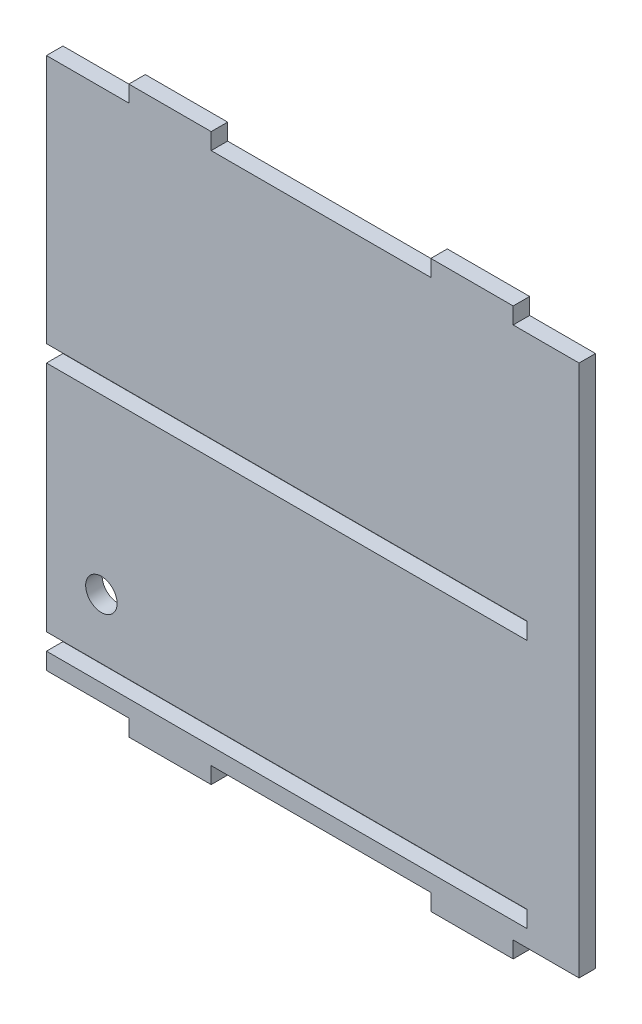
ISO-10303-21;
HEADER;
FILE_DESCRIPTION(('STEP AP214'),'2;1');
FILE_NAME('part.step','',(''),(''),'','','');
FILE_SCHEMA(('AUTOMOTIVE_DESIGN { 1 0 10303 214 1 1 1 1 }'));
ENDSEC;
DATA;
#1=APPLICATION_CONTEXT('core data for automotive mechanical design processes');
#2=APPLICATION_PROTOCOL_DEFINITION('international standard','automotive_design',2000,#1);
#3=PRODUCT_CONTEXT('',#1,'mechanical');
#4=PRODUCT('Part','Part','',(#3));
#5=PRODUCT_RELATED_PRODUCT_CATEGORY('part','',(#4));
#6=PRODUCT_DEFINITION_FORMATION('','',#4);
#7=PRODUCT_DEFINITION_CONTEXT('part definition',#1,'design');
#8=PRODUCT_DEFINITION('design','',#6,#7);
#9=PRODUCT_DEFINITION_SHAPE('','',#8);
#10=(LENGTH_UNIT() NAMED_UNIT(*) SI_UNIT(.MILLI.,.METRE.));
#11=(NAMED_UNIT(*) PLANE_ANGLE_UNIT() SI_UNIT($,.RADIAN.));
#12=(NAMED_UNIT(*) SI_UNIT($,.STERADIAN.) SOLID_ANGLE_UNIT());
#13=UNCERTAINTY_MEASURE_WITH_UNIT(LENGTH_MEASURE(1.E-05),#10,'distance_accuracy_value','');
#14=(GEOMETRIC_REPRESENTATION_CONTEXT(3) GLOBAL_UNCERTAINTY_ASSIGNED_CONTEXT((#13)) GLOBAL_UNIT_ASSIGNED_CONTEXT((#10,
#11,#12)) REPRESENTATION_CONTEXT('',''));
#15=CARTESIAN_POINT('',(0.,0.,0.));
#16=DIRECTION('',(0.,0.,1.));
#17=DIRECTION('',(1.,0.,0.));
#18=AXIS2_PLACEMENT_3D('',#15,#16,#17);
#19=CARTESIAN_POINT('',(-97.,97.,6.));
#20=DIRECTION('',(1.,0.,0.));
#21=DIRECTION('',(0.,1.,0.));
#22=AXIS2_PLACEMENT_3D('',#19,#20,#21);
#23=PLANE('',#22);
#24=DIRECTION('',(0.,-1.,0.));
#25=VECTOR('',#24,1.);
#26=CARTESIAN_POINT('',(-97.,97.,0.));
#27=LINE('',#26,#25);
#28=CARTESIAN_POINT('',(-97.,97.,0.));
#29=VERTEX_POINT('',#28);
#30=CARTESIAN_POINT('',(-97.,6.1,0.));
#31=VERTEX_POINT('',#30);
#32=EDGE_CURVE('E329',#29,#31,#27,.T.);
#33=ORIENTED_EDGE('',*,*,#32,.T.);
#34=DIRECTION('',(0.,0.,1.));
#35=VECTOR('',#34,1.);
#36=CARTESIAN_POINT('',(-97.,6.1,-4.));
#37=LINE('',#36,#35);
#38=CARTESIAN_POINT('',(-97.,6.1,6.));
#39=VERTEX_POINT('',#38);
#40=EDGE_CURVE('E298',#31,#39,#37,.T.);
#41=ORIENTED_EDGE('',*,*,#40,.T.);
#42=DIRECTION('',(0.,-1.,0.));
#43=VECTOR('',#42,1.);
#44=CARTESIAN_POINT('',(-97.,97.,6.));
#45=LINE('',#44,#43);
#46=CARTESIAN_POINT('',(-97.,97.,6.));
#47=VERTEX_POINT('',#46);
#48=EDGE_CURVE('E259',#47,#39,#45,.T.);
#49=ORIENTED_EDGE('',*,*,#48,.F.);
#50=DIRECTION('',(0.,0.,-1.));
#51=VECTOR('',#50,1.);
#52=CARTESIAN_POINT('',(-97.,97.,6.));
#53=LINE('',#52,#51);
#54=EDGE_CURVE('E394',#47,#29,#53,.T.);
#55=ORIENTED_EDGE('',*,*,#54,.T.);
#56=EDGE_LOOP('',(#33,#41,#49,#55));
#57=FACE_BOUND('',#56,.T.);
#58=ADVANCED_FACE('F45',(#57),#23,.F.);
#59=CARTESIAN_POINT('',(-97.,0.,6.));
#60=VERTEX_POINT('',#59);
#61=CARTESIAN_POINT('',(-97.,-84.8,6.));
#62=VERTEX_POINT('',#61);
#63=EDGE_CURVE('E248',#60,#62,#45,.T.);
#64=ORIENTED_EDGE('',*,*,#63,.F.);
#65=DIRECTION('',(0.,0.,1.));
#66=VECTOR('',#65,1.);
#67=CARTESIAN_POINT('',(-97.,0.,-4.));
#68=LINE('',#67,#66);
#69=CARTESIAN_POINT('',(-97.,0.,0.));
#70=VERTEX_POINT('',#69);
#71=EDGE_CURVE('E229',#70,#60,#68,.T.);
#72=ORIENTED_EDGE('',*,*,#71,.F.);
#73=CARTESIAN_POINT('',(-97.,-84.8,0.));
#74=VERTEX_POINT('',#73);
#75=EDGE_CURVE('E334',#70,#74,#27,.T.);
#76=ORIENTED_EDGE('',*,*,#75,.T.);
#77=DIRECTION('',(0.,0.,1.));
#78=VECTOR('',#77,1.);
#79=CARTESIAN_POINT('',(-97.,-84.8,-4.));
#80=LINE('',#79,#78);
#81=EDGE_CURVE('E257',#74,#62,#80,.T.);
#82=ORIENTED_EDGE('',*,*,#81,.T.);
#83=EDGE_LOOP('',(#64,#72,#76,#82));
#84=FACE_BOUND('',#83,.T.);
#85=ADVANCED_FACE('F256',(#84),#23,.F.);
#86=CARTESIAN_POINT('',(73.,-97.,6.));
#87=DIRECTION('',(0.,1.,0.));
#88=DIRECTION('',(-1.,0.,0.));
#89=AXIS2_PLACEMENT_3D('',#86,#87,#88);
#90=PLANE('',#89);
#91=DIRECTION('',(1.,0.,0.));
#92=VECTOR('',#91,1.);
#93=CARTESIAN_POINT('',(73.,-97.,0.));
#94=LINE('',#93,#92);
#95=CARTESIAN_POINT('',(73.,-97.,0.));
#96=VERTEX_POINT('',#95);
#97=CARTESIAN_POINT('',(97.,-97.,0.));
#98=VERTEX_POINT('',#97);
#99=EDGE_CURVE('E293',#96,#98,#94,.T.);
#100=ORIENTED_EDGE('',*,*,#99,.T.);
#101=DIRECTION('',(0.,0.,-1.));
#102=VECTOR('',#101,1.);
#103=CARTESIAN_POINT('',(97.,-97.,6.));
#104=LINE('',#103,#102);
#105=CARTESIAN_POINT('',(97.,-97.,6.));
#106=VERTEX_POINT('',#105);
#107=EDGE_CURVE('E434',#106,#98,#104,.T.);
#108=ORIENTED_EDGE('',*,*,#107,.F.);
#109=DIRECTION('',(1.,0.,0.));
#110=VECTOR('',#109,1.);
#111=CARTESIAN_POINT('',(73.,-97.,6.));
#112=LINE('',#111,#110);
#113=CARTESIAN_POINT('',(73.,-97.,6.));
#114=VERTEX_POINT('',#113);
#115=EDGE_CURVE('E358',#114,#106,#112,.T.);
#116=ORIENTED_EDGE('',*,*,#115,.F.);
#117=DIRECTION('',(0.,0.,-1.));
#118=VECTOR('',#117,1.);
#119=CARTESIAN_POINT('',(73.,-97.,6.));
#120=LINE('',#119,#118);
#121=EDGE_CURVE('E292',#114,#96,#120,.T.);
#122=ORIENTED_EDGE('',*,*,#121,.T.);
#123=EDGE_LOOP('',(#100,#108,#116,#122));
#124=FACE_BOUND('',#123,.T.);
#125=ADVANCED_FACE('F47',(#124),#90,.F.);
#126=CARTESIAN_POINT('',(97.,97.,6.));
#127=DIRECTION('',(-1.,0.,0.));
#128=DIRECTION('',(0.,-1.,0.));
#129=AXIS2_PLACEMENT_3D('',#126,#127,#128);
#130=PLANE('',#129);
#131=DIRECTION('',(0.,1.,0.));
#132=VECTOR('',#131,1.);
#133=CARTESIAN_POINT('',(97.,97.,0.));
#134=LINE('',#133,#132);
#135=CARTESIAN_POINT('',(97.,97.,0.));
#136=VERTEX_POINT('',#135);
#137=EDGE_CURVE('E297',#98,#136,#134,.T.);
#138=ORIENTED_EDGE('',*,*,#137,.T.);
#139=DIRECTION('',(0.,0.,-1.));
#140=VECTOR('',#139,1.);
#141=CARTESIAN_POINT('',(97.,97.,6.));
#142=LINE('',#141,#140);
#143=CARTESIAN_POINT('',(97.,97.,6.));
#144=VERTEX_POINT('',#143);
#145=EDGE_CURVE('E430',#144,#136,#142,.T.);
#146=ORIENTED_EDGE('',*,*,#145,.F.);
#147=DIRECTION('',(0.,1.,0.));
#148=VECTOR('',#147,1.);
#149=CARTESIAN_POINT('',(97.,97.,6.));
#150=LINE('',#149,#148);
#151=EDGE_CURVE('E502',#106,#144,#150,.T.);
#152=ORIENTED_EDGE('',*,*,#151,.F.);
#153=ORIENTED_EDGE('',*,*,#107,.T.);
#154=EDGE_LOOP('',(#138,#146,#152,#153));
#155=FACE_BOUND('',#154,.T.);
#156=ADVANCED_FACE('F621',(#155),#130,.F.);
#157=CARTESIAN_POINT('',(73.,97.,6.));
#158=DIRECTION('',(0.,-1.,0.));
#159=DIRECTION('',(0.,0.,-1.));
#160=AXIS2_PLACEMENT_3D('',#157,#158,#159);
#161=PLANE('',#160);
#162=DIRECTION('',(-1.,0.,0.));
#163=VECTOR('',#162,1.);
#164=CARTESIAN_POINT('',(73.,97.,0.));
#165=LINE('',#164,#163);
#166=CARTESIAN_POINT('',(73.,97.,0.));
#167=VERTEX_POINT('',#166);
#168=EDGE_CURVE('E301',#136,#167,#165,.T.);
#169=ORIENTED_EDGE('',*,*,#168,.T.);
#170=DIRECTION('',(0.,0.,-1.));
#171=VECTOR('',#170,1.);
#172=CARTESIAN_POINT('',(73.,97.,6.));
#173=LINE('',#172,#171);
#174=CARTESIAN_POINT('',(73.,97.,6.));
#175=VERTEX_POINT('',#174);
#176=EDGE_CURVE('E426',#175,#167,#173,.T.);
#177=ORIENTED_EDGE('',*,*,#176,.F.);
#178=DIRECTION('',(-1.,0.,0.));
#179=VECTOR('',#178,1.);
#180=CARTESIAN_POINT('',(73.,97.,6.));
#181=LINE('',#180,#179);
#182=EDGE_CURVE('E505',#144,#175,#181,.T.);
#183=ORIENTED_EDGE('',*,*,#182,.F.);
#184=ORIENTED_EDGE('',*,*,#145,.T.);
#185=EDGE_LOOP('',(#169,#177,#183,#184));
#186=FACE_BOUND('',#185,.T.);
#187=ADVANCED_FACE('F618',(#186),#161,.F.);
#188=CARTESIAN_POINT('',(73.,97.,6.));
#189=DIRECTION('',(-1.,0.,0.));
#190=DIRECTION('',(0.,0.,1.));
#191=AXIS2_PLACEMENT_3D('',#188,#189,#190);
#192=PLANE('',#191);
#193=DIRECTION('',(0.,1.,0.));
#194=VECTOR('',#193,1.);
#195=CARTESIAN_POINT('',(73.,97.,0.));
#196=LINE('',#195,#194);
#197=CARTESIAN_POINT('',(73.,103.,0.));
#198=VERTEX_POINT('',#197);
#199=EDGE_CURVE('E304',#167,#198,#196,.T.);
#200=ORIENTED_EDGE('',*,*,#199,.T.);
#201=DIRECTION('',(0.,0.,-1.));
#202=VECTOR('',#201,1.);
#203=CARTESIAN_POINT('',(73.,103.,6.));
#204=LINE('',#203,#202);
#205=CARTESIAN_POINT('',(73.,103.,6.));
#206=VERTEX_POINT('',#205);
#207=EDGE_CURVE('E422',#206,#198,#204,.T.);
#208=ORIENTED_EDGE('',*,*,#207,.F.);
#209=DIRECTION('',(0.,1.,0.));
#210=VECTOR('',#209,1.);
#211=CARTESIAN_POINT('',(73.,97.,6.));
#212=LINE('',#211,#210);
#213=EDGE_CURVE('E508',#175,#206,#212,.T.);
#214=ORIENTED_EDGE('',*,*,#213,.F.);
#215=ORIENTED_EDGE('',*,*,#176,.T.);
#216=EDGE_LOOP('',(#200,#208,#214,#215));
#217=FACE_BOUND('',#216,.T.);
#218=ADVANCED_FACE('F614',(#217),#192,.F.);
#219=CARTESIAN_POINT('',(43.,103.,6.));
#220=DIRECTION('',(0.,-1.,0.));
#221=DIRECTION('',(0.,0.,-1.));
#222=AXIS2_PLACEMENT_3D('',#219,#220,#221);
#223=PLANE('',#222);
#224=DIRECTION('',(-1.,0.,0.));
#225=VECTOR('',#224,1.);
#226=CARTESIAN_POINT('',(43.,103.,0.));
#227=LINE('',#226,#225);
#228=CARTESIAN_POINT('',(43.,103.,0.));
#229=VERTEX_POINT('',#228);
#230=EDGE_CURVE('E307',#198,#229,#227,.T.);
#231=ORIENTED_EDGE('',*,*,#230,.T.);
#232=DIRECTION('',(0.,0.,-1.));
#233=VECTOR('',#232,1.);
#234=CARTESIAN_POINT('',(43.,103.,6.));
#235=LINE('',#234,#233);
#236=CARTESIAN_POINT('',(43.,103.,6.));
#237=VERTEX_POINT('',#236);
#238=EDGE_CURVE('E418',#237,#229,#235,.T.);
#239=ORIENTED_EDGE('',*,*,#238,.F.);
#240=DIRECTION('',(-1.,0.,0.));
#241=VECTOR('',#240,1.);
#242=CARTESIAN_POINT('',(43.,103.,6.));
#243=LINE('',#242,#241);
#244=EDGE_CURVE('E511',#206,#237,#243,.T.);
#245=ORIENTED_EDGE('',*,*,#244,.F.);
#246=ORIENTED_EDGE('',*,*,#207,.T.);
#247=EDGE_LOOP('',(#231,#239,#245,#246));
#248=FACE_BOUND('',#247,.T.);
#249=ADVANCED_FACE('F610',(#248),#223,.F.);
#250=CARTESIAN_POINT('',(43.,97.,6.));
#251=DIRECTION('',(1.,0.,0.));
#252=DIRECTION('',(0.,0.,-1.));
#253=AXIS2_PLACEMENT_3D('',#250,#251,#252);
#254=PLANE('',#253);
#255=DIRECTION('',(0.,-1.,0.));
#256=VECTOR('',#255,1.);
#257=CARTESIAN_POINT('',(43.,97.,0.));
#258=LINE('',#257,#256);
#259=CARTESIAN_POINT('',(43.,97.,0.));
#260=VERTEX_POINT('',#259);
#261=EDGE_CURVE('E310',#229,#260,#258,.T.);
#262=ORIENTED_EDGE('',*,*,#261,.T.);
#263=DIRECTION('',(0.,0.,-1.));
#264=VECTOR('',#263,1.);
#265=CARTESIAN_POINT('',(43.,97.,6.));
#266=LINE('',#265,#264);
#267=CARTESIAN_POINT('',(43.,97.,6.));
#268=VERTEX_POINT('',#267);
#269=EDGE_CURVE('E414',#268,#260,#266,.T.);
#270=ORIENTED_EDGE('',*,*,#269,.F.);
#271=DIRECTION('',(0.,-1.,0.));
#272=VECTOR('',#271,1.);
#273=CARTESIAN_POINT('',(43.,97.,6.));
#274=LINE('',#273,#272);
#275=EDGE_CURVE('E514',#237,#268,#274,.T.);
#276=ORIENTED_EDGE('',*,*,#275,.F.);
#277=ORIENTED_EDGE('',*,*,#238,.T.);
#278=EDGE_LOOP('',(#262,#270,#276,#277));
#279=FACE_BOUND('',#278,.T.);
#280=ADVANCED_FACE('F606',(#279),#254,.F.);
#281=CARTESIAN_POINT('',(-37.,97.,6.));
#282=DIRECTION('',(0.,-1.,0.));
#283=DIRECTION('',(0.,0.,-1.));
#284=AXIS2_PLACEMENT_3D('',#281,#282,#283);
#285=PLANE('',#284);
#286=DIRECTION('',(-1.,0.,0.));
#287=VECTOR('',#286,1.);
#288=CARTESIAN_POINT('',(-37.,97.,0.));
#289=LINE('',#288,#287);
#290=CARTESIAN_POINT('',(-37.,97.,0.));
#291=VERTEX_POINT('',#290);
#292=EDGE_CURVE('E313',#260,#291,#289,.T.);
#293=ORIENTED_EDGE('',*,*,#292,.T.);
#294=DIRECTION('',(0.,0.,-1.));
#295=VECTOR('',#294,1.);
#296=CARTESIAN_POINT('',(-37.,97.,6.));
#297=LINE('',#296,#295);
#298=CARTESIAN_POINT('',(-37.,97.,6.));
#299=VERTEX_POINT('',#298);
#300=EDGE_CURVE('E410',#299,#291,#297,.T.);
#301=ORIENTED_EDGE('',*,*,#300,.F.);
#302=DIRECTION('',(-1.,0.,0.));
#303=VECTOR('',#302,1.);
#304=CARTESIAN_POINT('',(-37.,97.,6.));
#305=LINE('',#304,#303);
#306=EDGE_CURVE('E517',#268,#299,#305,.T.);
#307=ORIENTED_EDGE('',*,*,#306,.F.);
#308=ORIENTED_EDGE('',*,*,#269,.T.);
#309=EDGE_LOOP('',(#293,#301,#307,#308));
#310=FACE_BOUND('',#309,.T.);
#311=ADVANCED_FACE('F602',(#310),#285,.F.);
#312=CARTESIAN_POINT('',(-37.,97.,6.));
#313=DIRECTION('',(-1.,0.,0.));
#314=DIRECTION('',(0.,0.,1.));
#315=AXIS2_PLACEMENT_3D('',#312,#313,#314);
#316=PLANE('',#315);
#317=DIRECTION('',(0.,1.,0.));
#318=VECTOR('',#317,1.);
#319=CARTESIAN_POINT('',(-37.,97.,0.));
#320=LINE('',#319,#318);
#321=CARTESIAN_POINT('',(-37.,103.,0.));
#322=VERTEX_POINT('',#321);
#323=EDGE_CURVE('E316',#291,#322,#320,.T.);
#324=ORIENTED_EDGE('',*,*,#323,.T.);
#325=DIRECTION('',(0.,0.,-1.));
#326=VECTOR('',#325,1.);
#327=CARTESIAN_POINT('',(-37.,103.,6.));
#328=LINE('',#327,#326);
#329=CARTESIAN_POINT('',(-37.,103.,6.));
#330=VERTEX_POINT('',#329);
#331=EDGE_CURVE('E406',#330,#322,#328,.T.);
#332=ORIENTED_EDGE('',*,*,#331,.F.);
#333=DIRECTION('',(0.,1.,0.));
#334=VECTOR('',#333,1.);
#335=CARTESIAN_POINT('',(-37.,97.,6.));
#336=LINE('',#335,#334);
#337=EDGE_CURVE('E520',#299,#330,#336,.T.);
#338=ORIENTED_EDGE('',*,*,#337,.F.);
#339=ORIENTED_EDGE('',*,*,#300,.T.);
#340=EDGE_LOOP('',(#324,#332,#338,#339));
#341=FACE_BOUND('',#340,.T.);
#342=ADVANCED_FACE('F598',(#341),#316,.F.);
#343=CARTESIAN_POINT('',(-67.,103.,6.));
#344=DIRECTION('',(0.,-1.,0.));
#345=DIRECTION('',(0.,0.,-1.));
#346=AXIS2_PLACEMENT_3D('',#343,#344,#345);
#347=PLANE('',#346);
#348=DIRECTION('',(-1.,0.,0.));
#349=VECTOR('',#348,1.);
#350=CARTESIAN_POINT('',(-67.,103.,0.));
#351=LINE('',#350,#349);
#352=CARTESIAN_POINT('',(-67.,103.,0.));
#353=VERTEX_POINT('',#352);
#354=EDGE_CURVE('E319',#322,#353,#351,.T.);
#355=ORIENTED_EDGE('',*,*,#354,.T.);
#356=DIRECTION('',(0.,0.,-1.));
#357=VECTOR('',#356,1.);
#358=CARTESIAN_POINT('',(-67.,103.,6.));
#359=LINE('',#358,#357);
#360=CARTESIAN_POINT('',(-67.,103.,6.));
#361=VERTEX_POINT('',#360);
#362=EDGE_CURVE('E402',#361,#353,#359,.T.);
#363=ORIENTED_EDGE('',*,*,#362,.F.);
#364=DIRECTION('',(-1.,0.,0.));
#365=VECTOR('',#364,1.);
#366=CARTESIAN_POINT('',(-67.,103.,6.));
#367=LINE('',#366,#365);
#368=EDGE_CURVE('E523',#330,#361,#367,.T.);
#369=ORIENTED_EDGE('',*,*,#368,.F.);
#370=ORIENTED_EDGE('',*,*,#331,.T.);
#371=EDGE_LOOP('',(#355,#363,#369,#370));
#372=FACE_BOUND('',#371,.T.);
#373=ADVANCED_FACE('F592',(#372),#347,.F.);
#374=CARTESIAN_POINT('',(-67.,97.,6.));
#375=DIRECTION('',(1.,0.,0.));
#376=DIRECTION('',(0.,0.,-1.));
#377=AXIS2_PLACEMENT_3D('',#374,#375,#376);
#378=PLANE('',#377);
#379=DIRECTION('',(0.,-1.,0.));
#380=VECTOR('',#379,1.);
#381=CARTESIAN_POINT('',(-67.,97.,0.));
#382=LINE('',#381,#380);
#383=CARTESIAN_POINT('',(-67.,97.,0.));
#384=VERTEX_POINT('',#383);
#385=EDGE_CURVE('E322',#353,#384,#382,.T.);
#386=ORIENTED_EDGE('',*,*,#385,.T.);
#387=DIRECTION('',(0.,0.,-1.));
#388=VECTOR('',#387,1.);
#389=CARTESIAN_POINT('',(-67.,97.,6.));
#390=LINE('',#389,#388);
#391=CARTESIAN_POINT('',(-67.,97.,6.));
#392=VERTEX_POINT('',#391);
#393=EDGE_CURVE('E398',#392,#384,#390,.T.);
#394=ORIENTED_EDGE('',*,*,#393,.F.);
#395=DIRECTION('',(0.,-1.,0.));
#396=VECTOR('',#395,1.);
#397=CARTESIAN_POINT('',(-67.,97.,6.));
#398=LINE('',#397,#396);
#399=EDGE_CURVE('E525',#361,#392,#398,.T.);
#400=ORIENTED_EDGE('',*,*,#399,.F.);
#401=ORIENTED_EDGE('',*,*,#362,.T.);
#402=EDGE_LOOP('',(#386,#394,#400,#401));
#403=FACE_BOUND('',#402,.T.);
#404=ADVANCED_FACE('F588',(#403),#378,.F.);
#405=CARTESIAN_POINT('',(-67.,97.,6.));
#406=DIRECTION('',(0.,-1.,0.));
#407=DIRECTION('',(0.,0.,-1.));
#408=AXIS2_PLACEMENT_3D('',#405,#406,#407);
#409=PLANE('',#408);
#410=DIRECTION('',(-1.,0.,0.));
#411=VECTOR('',#410,1.);
#412=CARTESIAN_POINT('',(-67.,97.,0.));
#413=LINE('',#412,#411);
#414=EDGE_CURVE('E325',#384,#29,#413,.T.);
#415=ORIENTED_EDGE('',*,*,#414,.T.);
#416=ORIENTED_EDGE('',*,*,#54,.F.);
#417=DIRECTION('',(-1.,0.,0.));
#418=VECTOR('',#417,1.);
#419=CARTESIAN_POINT('',(-67.,97.,6.));
#420=LINE('',#419,#418);
#421=EDGE_CURVE('E265',#392,#47,#420,.T.);
#422=ORIENTED_EDGE('',*,*,#421,.F.);
#423=ORIENTED_EDGE('',*,*,#393,.T.);
#424=EDGE_LOOP('',(#415,#416,#422,#423));
#425=FACE_BOUND('',#424,.T.);
#426=ADVANCED_FACE('F534',(#425),#409,.F.);
#427=CARTESIAN_POINT('',(-97.,-90.9,6.));
#428=VERTEX_POINT('',#427);
#429=CARTESIAN_POINT('',(-97.,-97.,6.));
#430=VERTEX_POINT('',#429);
#431=EDGE_CURVE('E260',#428,#430,#45,.T.);
#432=ORIENTED_EDGE('',*,*,#431,.F.);
#433=DIRECTION('',(0.,0.,1.));
#434=VECTOR('',#433,1.);
#435=CARTESIAN_POINT('',(-97.,-90.9,-4.));
#436=LINE('',#435,#434);
#437=CARTESIAN_POINT('',(-97.,-90.9,0.));
#438=VERTEX_POINT('',#437);
#439=EDGE_CURVE('E469',#438,#428,#436,.T.);
#440=ORIENTED_EDGE('',*,*,#439,.F.);
#441=CARTESIAN_POINT('',(-97.,-97.,0.));
#442=VERTEX_POINT('',#441);
#443=EDGE_CURVE('E328',#438,#442,#27,.T.);
#444=ORIENTED_EDGE('',*,*,#443,.T.);
#445=DIRECTION('',(0.,0.,-1.));
#446=VECTOR('',#445,1.);
#447=CARTESIAN_POINT('',(-97.,-97.,6.));
#448=LINE('',#447,#446);
#449=EDGE_CURVE('E390',#430,#442,#448,.T.);
#450=ORIENTED_EDGE('',*,*,#449,.F.);
#451=EDGE_LOOP('',(#432,#440,#444,#450));
#452=FACE_BOUND('',#451,.T.);
#453=ADVANCED_FACE('F467',(#452),#23,.F.);
#454=CARTESIAN_POINT('',(-67.,-97.,6.));
#455=DIRECTION('',(0.,1.,0.));
#456=DIRECTION('',(0.,0.,1.));
#457=AXIS2_PLACEMENT_3D('',#454,#455,#456);
#458=PLANE('',#457);
#459=DIRECTION('',(1.,0.,0.));
#460=VECTOR('',#459,1.);
#461=CARTESIAN_POINT('',(-67.,-97.,0.));
#462=LINE('',#461,#460);
#463=CARTESIAN_POINT('',(-67.,-97.,0.));
#464=VERTEX_POINT('',#463);
#465=EDGE_CURVE('E333',#442,#464,#462,.T.);
#466=ORIENTED_EDGE('',*,*,#465,.T.);
#467=DIRECTION('',(0.,0.,-1.));
#468=VECTOR('',#467,1.);
#469=CARTESIAN_POINT('',(-67.,-97.,6.));
#470=LINE('',#469,#468);
#471=CARTESIAN_POINT('',(-67.,-97.,6.));
#472=VERTEX_POINT('',#471);
#473=EDGE_CURVE('E386',#472,#464,#470,.T.);
#474=ORIENTED_EDGE('',*,*,#473,.F.);
#475=DIRECTION('',(1.,0.,0.));
#476=VECTOR('',#475,1.);
#477=CARTESIAN_POINT('',(-67.,-97.,6.));
#478=LINE('',#477,#476);
#479=EDGE_CURVE('E264',#430,#472,#478,.T.);
#480=ORIENTED_EDGE('',*,*,#479,.F.);
#481=ORIENTED_EDGE('',*,*,#449,.T.);
#482=EDGE_LOOP('',(#466,#474,#480,#481));
#483=FACE_BOUND('',#482,.T.);
#484=ADVANCED_FACE('F473',(#483),#458,.F.);
#485=CARTESIAN_POINT('',(-67.,-97.,6.));
#486=DIRECTION('',(1.,0.,0.));
#487=DIRECTION('',(0.,0.,-1.));
#488=AXIS2_PLACEMENT_3D('',#485,#486,#487);
#489=PLANE('',#488);
#490=DIRECTION('',(0.,-1.,0.));
#491=VECTOR('',#490,1.);
#492=CARTESIAN_POINT('',(-67.,-97.,0.));
#493=LINE('',#492,#491);
#494=CARTESIAN_POINT('',(-67.,-103.,0.));
#495=VERTEX_POINT('',#494);
#496=EDGE_CURVE('E337',#464,#495,#493,.T.);
#497=ORIENTED_EDGE('',*,*,#496,.T.);
#498=DIRECTION('',(0.,0.,-1.));
#499=VECTOR('',#498,1.);
#500=CARTESIAN_POINT('',(-67.,-103.,6.));
#501=LINE('',#500,#499);
#502=CARTESIAN_POINT('',(-67.,-103.,6.));
#503=VERTEX_POINT('',#502);
#504=EDGE_CURVE('E382',#503,#495,#501,.T.);
#505=ORIENTED_EDGE('',*,*,#504,.F.);
#506=DIRECTION('',(0.,-1.,0.));
#507=VECTOR('',#506,1.);
#508=CARTESIAN_POINT('',(-67.,-97.,6.));
#509=LINE('',#508,#507);
#510=EDGE_CURVE('E271',#472,#503,#509,.T.);
#511=ORIENTED_EDGE('',*,*,#510,.F.);
#512=ORIENTED_EDGE('',*,*,#473,.T.);
#513=EDGE_LOOP('',(#497,#505,#511,#512));
#514=FACE_BOUND('',#513,.T.);
#515=ADVANCED_FACE('F480',(#514),#489,.F.);
#516=CARTESIAN_POINT('',(-67.,-103.,6.));
#517=DIRECTION('',(0.,1.,0.));
#518=DIRECTION('',(-1.,0.,0.));
#519=AXIS2_PLACEMENT_3D('',#516,#517,#518);
#520=PLANE('',#519);
#521=DIRECTION('',(1.,0.,0.));
#522=VECTOR('',#521,1.);
#523=CARTESIAN_POINT('',(-67.,-103.,0.));
#524=LINE('',#523,#522);
#525=CARTESIAN_POINT('',(-37.,-103.,0.));
#526=VERTEX_POINT('',#525);
#527=EDGE_CURVE('E340',#495,#526,#524,.T.);
#528=ORIENTED_EDGE('',*,*,#527,.T.);
#529=DIRECTION('',(0.,0.,-1.));
#530=VECTOR('',#529,1.);
#531=CARTESIAN_POINT('',(-37.,-103.,6.));
#532=LINE('',#531,#530);
#533=CARTESIAN_POINT('',(-37.,-103.,6.));
#534=VERTEX_POINT('',#533);
#535=EDGE_CURVE('E378',#534,#526,#532,.T.);
#536=ORIENTED_EDGE('',*,*,#535,.F.);
#537=DIRECTION('',(1.,0.,0.));
#538=VECTOR('',#537,1.);
#539=CARTESIAN_POINT('',(-67.,-103.,6.));
#540=LINE('',#539,#538);
#541=EDGE_CURVE('E274',#503,#534,#540,.T.);
#542=ORIENTED_EDGE('',*,*,#541,.F.);
#543=ORIENTED_EDGE('',*,*,#504,.T.);
#544=EDGE_LOOP('',(#528,#536,#542,#543));
#545=FACE_BOUND('',#544,.T.);
#546=ADVANCED_FACE('F484',(#545),#520,.F.);
#547=CARTESIAN_POINT('',(-37.,-97.,6.));
#548=DIRECTION('',(-1.,0.,0.));
#549=DIRECTION('',(0.,-1.,0.));
#550=AXIS2_PLACEMENT_3D('',#547,#548,#549);
#551=PLANE('',#550);
#552=DIRECTION('',(0.,1.,0.));
#553=VECTOR('',#552,1.);
#554=CARTESIAN_POINT('',(-37.,-97.,0.));
#555=LINE('',#554,#553);
#556=CARTESIAN_POINT('',(-37.,-97.,0.));
#557=VERTEX_POINT('',#556);
#558=EDGE_CURVE('E343',#526,#557,#555,.T.);
#559=ORIENTED_EDGE('',*,*,#558,.T.);
#560=DIRECTION('',(0.,0.,-1.));
#561=VECTOR('',#560,1.);
#562=CARTESIAN_POINT('',(-37.,-97.,6.));
#563=LINE('',#562,#561);
#564=CARTESIAN_POINT('',(-37.,-97.,6.));
#565=VERTEX_POINT('',#564);
#566=EDGE_CURVE('E374',#565,#557,#563,.T.);
#567=ORIENTED_EDGE('',*,*,#566,.F.);
#568=DIRECTION('',(0.,1.,0.));
#569=VECTOR('',#568,1.);
#570=CARTESIAN_POINT('',(-37.,-97.,6.));
#571=LINE('',#570,#569);
#572=EDGE_CURVE('E277',#534,#565,#571,.T.);
#573=ORIENTED_EDGE('',*,*,#572,.F.);
#574=ORIENTED_EDGE('',*,*,#535,.T.);
#575=EDGE_LOOP('',(#559,#567,#573,#574));
#576=FACE_BOUND('',#575,.T.);
#577=ADVANCED_FACE('F666',(#576),#551,.F.);
#578=CARTESIAN_POINT('',(-37.,-97.,6.));
#579=DIRECTION('',(0.,1.,0.));
#580=DIRECTION('',(-1.,0.,0.));
#581=AXIS2_PLACEMENT_3D('',#578,#579,#580);
#582=PLANE('',#581);
#583=DIRECTION('',(1.,0.,0.));
#584=VECTOR('',#583,1.);
#585=CARTESIAN_POINT('',(-37.,-97.,0.));
#586=LINE('',#585,#584);
#587=CARTESIAN_POINT('',(43.,-97.,0.));
#588=VERTEX_POINT('',#587);
#589=EDGE_CURVE('E346',#557,#588,#586,.T.);
#590=ORIENTED_EDGE('',*,*,#589,.T.);
#591=DIRECTION('',(0.,0.,-1.));
#592=VECTOR('',#591,1.);
#593=CARTESIAN_POINT('',(43.,-97.,6.));
#594=LINE('',#593,#592);
#595=CARTESIAN_POINT('',(43.,-97.,6.));
#596=VERTEX_POINT('',#595);
#597=EDGE_CURVE('E370',#596,#588,#594,.T.);
#598=ORIENTED_EDGE('',*,*,#597,.F.);
#599=DIRECTION('',(1.,0.,0.));
#600=VECTOR('',#599,1.);
#601=CARTESIAN_POINT('',(-37.,-97.,6.));
#602=LINE('',#601,#600);
#603=EDGE_CURVE('E280',#565,#596,#602,.T.);
#604=ORIENTED_EDGE('',*,*,#603,.F.);
#605=ORIENTED_EDGE('',*,*,#566,.T.);
#606=EDGE_LOOP('',(#590,#598,#604,#605));
#607=FACE_BOUND('',#606,.T.);
#608=ADVANCED_FACE('F663',(#607),#582,.F.);
#609=CARTESIAN_POINT('',(43.,-97.,6.));
#610=DIRECTION('',(1.,0.,0.));
#611=DIRECTION('',(0.,0.,-1.));
#612=AXIS2_PLACEMENT_3D('',#609,#610,#611);
#613=PLANE('',#612);
#614=DIRECTION('',(0.,-1.,0.));
#615=VECTOR('',#614,1.);
#616=CARTESIAN_POINT('',(43.,-97.,0.));
#617=LINE('',#616,#615);
#618=CARTESIAN_POINT('',(43.,-103.,0.));
#619=VERTEX_POINT('',#618);
#620=EDGE_CURVE('E349',#588,#619,#617,.T.);
#621=ORIENTED_EDGE('',*,*,#620,.T.);
#622=DIRECTION('',(0.,0.,-1.));
#623=VECTOR('',#622,1.);
#624=CARTESIAN_POINT('',(43.,-103.,6.));
#625=LINE('',#624,#623);
#626=CARTESIAN_POINT('',(43.,-103.,6.));
#627=VERTEX_POINT('',#626);
#628=EDGE_CURVE('E366',#627,#619,#625,.T.);
#629=ORIENTED_EDGE('',*,*,#628,.F.);
#630=DIRECTION('',(0.,-1.,0.));
#631=VECTOR('',#630,1.);
#632=CARTESIAN_POINT('',(43.,-97.,6.));
#633=LINE('',#632,#631);
#634=EDGE_CURVE('E283',#596,#627,#633,.T.);
#635=ORIENTED_EDGE('',*,*,#634,.F.);
#636=ORIENTED_EDGE('',*,*,#597,.T.);
#637=EDGE_LOOP('',(#621,#629,#635,#636));
#638=FACE_BOUND('',#637,.T.);
#639=ADVANCED_FACE('F659',(#638),#613,.F.);
#640=CARTESIAN_POINT('',(43.,-103.,6.));
#641=DIRECTION('',(0.,1.,0.));
#642=DIRECTION('',(0.,0.,1.));
#643=AXIS2_PLACEMENT_3D('',#640,#641,#642);
#644=PLANE('',#643);
#645=DIRECTION('',(1.,0.,0.));
#646=VECTOR('',#645,1.);
#647=CARTESIAN_POINT('',(43.,-103.,0.));
#648=LINE('',#647,#646);
#649=CARTESIAN_POINT('',(73.,-103.,0.));
#650=VERTEX_POINT('',#649);
#651=EDGE_CURVE('E352',#619,#650,#648,.T.);
#652=ORIENTED_EDGE('',*,*,#651,.T.);
#653=DIRECTION('',(0.,0.,-1.));
#654=VECTOR('',#653,1.);
#655=CARTESIAN_POINT('',(73.,-103.,6.));
#656=LINE('',#655,#654);
#657=CARTESIAN_POINT('',(73.,-103.,6.));
#658=VERTEX_POINT('',#657);
#659=EDGE_CURVE('E362',#658,#650,#656,.T.);
#660=ORIENTED_EDGE('',*,*,#659,.F.);
#661=DIRECTION('',(1.,0.,0.));
#662=VECTOR('',#661,1.);
#663=CARTESIAN_POINT('',(43.,-103.,6.));
#664=LINE('',#663,#662);
#665=EDGE_CURVE('E286',#627,#658,#664,.T.);
#666=ORIENTED_EDGE('',*,*,#665,.F.);
#667=ORIENTED_EDGE('',*,*,#628,.T.);
#668=EDGE_LOOP('',(#652,#660,#666,#667));
#669=FACE_BOUND('',#668,.T.);
#670=ADVANCED_FACE('F655',(#669),#644,.F.);
#671=CARTESIAN_POINT('',(73.,-97.,6.));
#672=DIRECTION('',(-1.,0.,0.));
#673=DIRECTION('',(0.,-1.,0.));
#674=AXIS2_PLACEMENT_3D('',#671,#672,#673);
#675=PLANE('',#674);
#676=DIRECTION('',(0.,1.,0.));
#677=VECTOR('',#676,1.);
#678=CARTESIAN_POINT('',(73.,-97.,0.));
#679=LINE('',#678,#677);
#680=EDGE_CURVE('E355',#650,#96,#679,.T.);
#681=ORIENTED_EDGE('',*,*,#680,.T.);
#682=ORIENTED_EDGE('',*,*,#121,.F.);
#683=DIRECTION('',(0.,1.,0.));
#684=VECTOR('',#683,1.);
#685=CARTESIAN_POINT('',(73.,-97.,6.));
#686=LINE('',#685,#684);
#687=EDGE_CURVE('E289',#658,#114,#686,.T.);
#688=ORIENTED_EDGE('',*,*,#687,.F.);
#689=ORIENTED_EDGE('',*,*,#659,.T.);
#690=EDGE_LOOP('',(#681,#682,#688,#689));
#691=FACE_BOUND('',#690,.T.);
#692=ADVANCED_FACE('F651',(#691),#675,.F.);
#693=CARTESIAN_POINT('',(0.,0.,6.));
#694=DIRECTION('',(0.,0.,-1.));
#695=DIRECTION('',(-1.,0.,0.));
#696=AXIS2_PLACEMENT_3D('',#693,#694,#695);
#697=PLANE('',#696);
#698=CARTESIAN_POINT('',(-77.,-63.,6.));
#699=DIRECTION('',(0.,0.,1.));
#700=DIRECTION('',(1.,0.,0.));
#701=AXIS2_PLACEMENT_3D('',#698,#699,#700);
#702=CIRCLE('',#701,5.72499999999999);
#703=CARTESIAN_POINT('',(-71.275,-63.,6.));
#704=VERTEX_POINT('',#703);
#705=EDGE_CURVE('E803',#704,#704,#702,.T.);
#706=ORIENTED_EDGE('',*,*,#705,.F.);
#707=EDGE_LOOP('',(#706));
#708=FACE_BOUND('',#707,.T.);
#709=ORIENTED_EDGE('',*,*,#48,.T.);
#710=DIRECTION('',(-1.,0.,0.));
#711=VECTOR('',#710,1.);
#712=CARTESIAN_POINT('',(-97.,6.1,6.));
#713=LINE('',#712,#711);
#714=CARTESIAN_POINT('',(78.,6.1,6.));
#715=VERTEX_POINT('',#714);
#716=EDGE_CURVE('E241',#715,#39,#713,.T.);
#717=ORIENTED_EDGE('',*,*,#716,.F.);
#718=DIRECTION('',(0.,1.,0.));
#719=VECTOR('',#718,1.);
#720=CARTESIAN_POINT('',(78.,0.,6.));
#721=LINE('',#720,#719);
#722=CARTESIAN_POINT('',(78.,0.,6.));
#723=VERTEX_POINT('',#722);
#724=EDGE_CURVE('E251',#723,#715,#721,.T.);
#725=ORIENTED_EDGE('',*,*,#724,.F.);
#726=DIRECTION('',(1.,0.,0.));
#727=VECTOR('',#726,1.);
#728=CARTESIAN_POINT('',(-97.,0.,6.));
#729=LINE('',#728,#727);
#730=EDGE_CURVE('E232',#60,#723,#729,.T.);
#731=ORIENTED_EDGE('',*,*,#730,.F.);
#732=ORIENTED_EDGE('',*,*,#63,.T.);
#733=DIRECTION('',(-1.,0.,0.));
#734=VECTOR('',#733,1.);
#735=CARTESIAN_POINT('',(-97.,-84.8,6.));
#736=LINE('',#735,#734);
#737=CARTESIAN_POINT('',(78.,-84.8,6.));
#738=VERTEX_POINT('',#737);
#739=EDGE_CURVE('E495',#738,#62,#736,.T.);
#740=ORIENTED_EDGE('',*,*,#739,.F.);
#741=DIRECTION('',(0.,1.,0.));
#742=VECTOR('',#741,1.);
#743=CARTESIAN_POINT('',(78.,-90.9,6.));
#744=LINE('',#743,#742);
#745=CARTESIAN_POINT('',(78.,-90.9,6.));
#746=VERTEX_POINT('',#745);
#747=EDGE_CURVE('E491',#746,#738,#744,.T.);
#748=ORIENTED_EDGE('',*,*,#747,.F.);
#749=DIRECTION('',(1.,0.,0.));
#750=VECTOR('',#749,1.);
#751=CARTESIAN_POINT('',(-97.,-90.9,6.));
#752=LINE('',#751,#750);
#753=EDGE_CURVE('E253',#428,#746,#752,.T.);
#754=ORIENTED_EDGE('',*,*,#753,.F.);
#755=ORIENTED_EDGE('',*,*,#431,.T.);
#756=ORIENTED_EDGE('',*,*,#479,.T.);
#757=ORIENTED_EDGE('',*,*,#510,.T.);
#758=ORIENTED_EDGE('',*,*,#541,.T.);
#759=ORIENTED_EDGE('',*,*,#572,.T.);
#760=ORIENTED_EDGE('',*,*,#603,.T.);
#761=ORIENTED_EDGE('',*,*,#634,.T.);
#762=ORIENTED_EDGE('',*,*,#665,.T.);
#763=ORIENTED_EDGE('',*,*,#687,.T.);
#764=ORIENTED_EDGE('',*,*,#115,.T.);
#765=ORIENTED_EDGE('',*,*,#151,.T.);
#766=ORIENTED_EDGE('',*,*,#182,.T.);
#767=ORIENTED_EDGE('',*,*,#213,.T.);
#768=ORIENTED_EDGE('',*,*,#244,.T.);
#769=ORIENTED_EDGE('',*,*,#275,.T.);
#770=ORIENTED_EDGE('',*,*,#306,.T.);
#771=ORIENTED_EDGE('',*,*,#337,.T.);
#772=ORIENTED_EDGE('',*,*,#368,.T.);
#773=ORIENTED_EDGE('',*,*,#399,.T.);
#774=ORIENTED_EDGE('',*,*,#421,.T.);
#775=EDGE_LOOP('',(#709,#717,#725,#731,#732,#740,#748,#754,#755,#756,#757,#758,#759,#760,#761,
#762,#763,#764,#765,#766,#767,#768,#769,#770,#771,#772,#773,#774));
#776=FACE_BOUND('',#775,.T.);
#777=ADVANCED_FACE('F246',(#708,#776),#697,.F.);
#778=CARTESIAN_POINT('',(0.,0.,0.));
#779=DIRECTION('',(0.,0.,-1.));
#780=DIRECTION('',(-1.,0.,0.));
#781=AXIS2_PLACEMENT_3D('',#778,#779,#780);
#782=PLANE('',#781);
#783=CARTESIAN_POINT('',(-77.,-63.,0.));
#784=DIRECTION('',(0.,0.,-1.));
#785=DIRECTION('',(-1.,0.,0.));
#786=AXIS2_PLACEMENT_3D('',#783,#784,#785);
#787=CIRCLE('',#786,5.72499999999999);
#788=CARTESIAN_POINT('',(-82.725,-63.,0.));
#789=VERTEX_POINT('',#788);
#790=EDGE_CURVE('E49',#789,#789,#787,.T.);
#791=ORIENTED_EDGE('',*,*,#790,.F.);
#792=EDGE_LOOP('',(#791));
#793=FACE_BOUND('',#792,.T.);
#794=DIRECTION('',(1.,0.,0.));
#795=VECTOR('',#794,1.);
#796=CARTESIAN_POINT('',(0.,6.1,0.));
#797=LINE('',#796,#795);
#798=CARTESIAN_POINT('',(78.,6.1,0.));
#799=VERTEX_POINT('',#798);
#800=EDGE_CURVE('E11',#31,#799,#797,.T.);
#801=ORIENTED_EDGE('',*,*,#800,.F.);
#802=ORIENTED_EDGE('',*,*,#32,.F.);
#803=ORIENTED_EDGE('',*,*,#414,.F.);
#804=ORIENTED_EDGE('',*,*,#385,.F.);
#805=ORIENTED_EDGE('',*,*,#354,.F.);
#806=ORIENTED_EDGE('',*,*,#323,.F.);
#807=ORIENTED_EDGE('',*,*,#292,.F.);
#808=ORIENTED_EDGE('',*,*,#261,.F.);
#809=ORIENTED_EDGE('',*,*,#230,.F.);
#810=ORIENTED_EDGE('',*,*,#199,.F.);
#811=ORIENTED_EDGE('',*,*,#168,.F.);
#812=ORIENTED_EDGE('',*,*,#137,.F.);
#813=ORIENTED_EDGE('',*,*,#99,.F.);
#814=ORIENTED_EDGE('',*,*,#680,.F.);
#815=ORIENTED_EDGE('',*,*,#651,.F.);
#816=ORIENTED_EDGE('',*,*,#620,.F.);
#817=ORIENTED_EDGE('',*,*,#589,.F.);
#818=ORIENTED_EDGE('',*,*,#558,.F.);
#819=ORIENTED_EDGE('',*,*,#527,.F.);
#820=ORIENTED_EDGE('',*,*,#496,.F.);
#821=ORIENTED_EDGE('',*,*,#465,.F.);
#822=ORIENTED_EDGE('',*,*,#443,.F.);
#823=DIRECTION('',(-1.,0.,0.));
#824=VECTOR('',#823,1.);
#825=CARTESIAN_POINT('',(0.,-90.9,0.));
#826=LINE('',#825,#824);
#827=CARTESIAN_POINT('',(78.,-90.9,0.));
#828=VERTEX_POINT('',#827);
#829=EDGE_CURVE('E438',#828,#438,#826,.T.);
#830=ORIENTED_EDGE('',*,*,#829,.F.);
#831=DIRECTION('',(0.,-1.,0.));
#832=VECTOR('',#831,1.);
#833=CARTESIAN_POINT('',(78.,0.,0.));
#834=LINE('',#833,#832);
#835=CARTESIAN_POINT('',(78.,-84.8,0.));
#836=VERTEX_POINT('',#835);
#837=EDGE_CURVE('E441',#836,#828,#834,.T.);
#838=ORIENTED_EDGE('',*,*,#837,.F.);
#839=DIRECTION('',(1.,0.,0.));
#840=VECTOR('',#839,1.);
#841=CARTESIAN_POINT('',(0.,-84.8,0.));
#842=LINE('',#841,#840);
#843=EDGE_CURVE('E444',#74,#836,#842,.T.);
#844=ORIENTED_EDGE('',*,*,#843,.F.);
#845=ORIENTED_EDGE('',*,*,#75,.F.);
#846=DIRECTION('',(-1.,0.,0.));
#847=VECTOR('',#846,1.);
#848=CARTESIAN_POINT('',(0.,0.,0.));
#849=LINE('',#848,#847);
#850=CARTESIAN_POINT('',(78.,0.,0.));
#851=VERTEX_POINT('',#850);
#852=EDGE_CURVE('E235',#851,#70,#849,.T.);
#853=ORIENTED_EDGE('',*,*,#852,.F.);
#854=DIRECTION('',(0.,-1.,0.));
#855=VECTOR('',#854,1.);
#856=CARTESIAN_POINT('',(78.,0.,0.));
#857=LINE('',#856,#855);
#858=EDGE_CURVE('E55',#799,#851,#857,.T.);
#859=ORIENTED_EDGE('',*,*,#858,.F.);
#860=EDGE_LOOP('',(#801,#802,#803,#804,#805,#806,#807,#808,#809,#810,#811,#812,#813,#814,#815,
#816,#817,#818,#819,#820,#821,#822,#830,#838,#844,#845,#853,#859));
#861=FACE_BOUND('',#860,.T.);
#862=ADVANCED_FACE('F457',(#793,#861),#782,.T.);
#863=CARTESIAN_POINT('',(-97.,-84.8,-4.));
#864=DIRECTION('',(0.,1.,0.));
#865=DIRECTION('',(0.,0.,1.));
#866=AXIS2_PLACEMENT_3D('',#863,#864,#865);
#867=PLANE('',#866);
#868=ORIENTED_EDGE('',*,*,#843,.T.);
#869=DIRECTION('',(0.,0.,1.));
#870=VECTOR('',#869,1.);
#871=CARTESIAN_POINT('',(78.,-84.8,-4.));
#872=LINE('',#871,#870);
#873=EDGE_CURVE('E553',#836,#738,#872,.T.);
#874=ORIENTED_EDGE('',*,*,#873,.T.);
#875=ORIENTED_EDGE('',*,*,#739,.T.);
#876=ORIENTED_EDGE('',*,*,#81,.F.);
#877=EDGE_LOOP('',(#868,#874,#875,#876));
#878=FACE_BOUND('',#877,.T.);
#879=ADVANCED_FACE('F559',(#878),#867,.F.);
#880=CARTESIAN_POINT('',(78.,-90.9,-4.));
#881=DIRECTION('',(1.,0.,0.));
#882=DIRECTION('',(0.,0.,-1.));
#883=AXIS2_PLACEMENT_3D('',#880,#881,#882);
#884=PLANE('',#883);
#885=ORIENTED_EDGE('',*,*,#837,.T.);
#886=DIRECTION('',(0.,0.,1.));
#887=VECTOR('',#886,1.);
#888=CARTESIAN_POINT('',(78.,-90.9,-4.));
#889=LINE('',#888,#887);
#890=EDGE_CURVE('E70',#828,#746,#889,.T.);
#891=ORIENTED_EDGE('',*,*,#890,.T.);
#892=ORIENTED_EDGE('',*,*,#747,.T.);
#893=ORIENTED_EDGE('',*,*,#873,.F.);
#894=EDGE_LOOP('',(#885,#891,#892,#893));
#895=FACE_BOUND('',#894,.T.);
#896=ADVANCED_FACE('F562',(#895),#884,.F.);
#897=CARTESIAN_POINT('',(-97.,-90.9,-4.));
#898=DIRECTION('',(0.,-1.,0.));
#899=DIRECTION('',(0.,0.,-1.));
#900=AXIS2_PLACEMENT_3D('',#897,#898,#899);
#901=PLANE('',#900);
#902=ORIENTED_EDGE('',*,*,#829,.T.);
#903=ORIENTED_EDGE('',*,*,#439,.T.);
#904=ORIENTED_EDGE('',*,*,#753,.T.);
#905=ORIENTED_EDGE('',*,*,#890,.F.);
#906=EDGE_LOOP('',(#902,#903,#904,#905));
#907=FACE_BOUND('',#906,.T.);
#908=ADVANCED_FACE('F563',(#907),#901,.F.);
#909=CARTESIAN_POINT('',(-97.,6.1,-4.));
#910=DIRECTION('',(0.,1.,0.));
#911=DIRECTION('',(0.,0.,1.));
#912=AXIS2_PLACEMENT_3D('',#909,#910,#911);
#913=PLANE('',#912);
#914=ORIENTED_EDGE('',*,*,#800,.T.);
#915=DIRECTION('',(0.,0.,1.));
#916=VECTOR('',#915,1.);
#917=CARTESIAN_POINT('',(78.,6.1,-4.));
#918=LINE('',#917,#916);
#919=EDGE_CURVE('E454',#799,#715,#918,.T.);
#920=ORIENTED_EDGE('',*,*,#919,.T.);
#921=ORIENTED_EDGE('',*,*,#716,.T.);
#922=ORIENTED_EDGE('',*,*,#40,.F.);
#923=EDGE_LOOP('',(#914,#920,#921,#922));
#924=FACE_BOUND('',#923,.T.);
#925=ADVANCED_FACE('F565',(#924),#913,.F.);
#926=CARTESIAN_POINT('',(78.,0.,-4.));
#927=DIRECTION('',(1.,0.,0.));
#928=DIRECTION('',(0.,0.,-1.));
#929=AXIS2_PLACEMENT_3D('',#926,#927,#928);
#930=PLANE('',#929);
#931=ORIENTED_EDGE('',*,*,#858,.T.);
#932=DIRECTION('',(0.,0.,1.));
#933=VECTOR('',#932,1.);
#934=CARTESIAN_POINT('',(78.,0.,-4.));
#935=LINE('',#934,#933);
#936=EDGE_CURVE('E62',#851,#723,#935,.T.);
#937=ORIENTED_EDGE('',*,*,#936,.T.);
#938=ORIENTED_EDGE('',*,*,#724,.T.);
#939=ORIENTED_EDGE('',*,*,#919,.F.);
#940=EDGE_LOOP('',(#931,#937,#938,#939));
#941=FACE_BOUND('',#940,.T.);
#942=ADVANCED_FACE('F453',(#941),#930,.F.);
#943=CARTESIAN_POINT('',(-97.,0.,-4.));
#944=DIRECTION('',(0.,-1.,0.));
#945=DIRECTION('',(1.,0.,0.));
#946=AXIS2_PLACEMENT_3D('',#943,#944,#945);
#947=PLANE('',#946);
#948=ORIENTED_EDGE('',*,*,#852,.T.);
#949=ORIENTED_EDGE('',*,*,#71,.T.);
#950=ORIENTED_EDGE('',*,*,#730,.T.);
#951=ORIENTED_EDGE('',*,*,#936,.F.);
#952=EDGE_LOOP('',(#948,#949,#950,#951));
#953=FACE_BOUND('',#952,.T.);
#954=ADVANCED_FACE('F231',(#953),#947,.F.);
#955=CARTESIAN_POINT('',(-77.,-63.,-4.));
#956=DIRECTION('',(0.,0.,1.));
#957=DIRECTION('',(1.,0.,0.));
#958=AXIS2_PLACEMENT_3D('',#955,#956,#957);
#959=CYLINDRICAL_SURFACE('',#958,5.72499999999999);
#960=ORIENTED_EDGE('',*,*,#790,.T.);
#961=EDGE_LOOP('',(#960));
#962=FACE_BOUND('',#961,.T.);
#963=ORIENTED_EDGE('',*,*,#705,.T.);
#964=EDGE_LOOP('',(#963));
#965=FACE_BOUND('',#964,.T.);
#966=ADVANCED_FACE('F788',(#962,#965),#959,.F.);
#967=CLOSED_SHELL('',(#58,#85,#125,#156,#187,#218,#249,#280,#311,#342,#373,#404,#426,#453,#484,
#515,#546,#577,#608,#639,#670,#692,#777,#862,#879,#896,#908,#925,#942,#954,#966));
#968=MANIFOLD_SOLID_BREP('B2',#967);
#969=ADVANCED_BREP_SHAPE_REPRESENTATION('',(#18,#968),#14);
#970=SHAPE_DEFINITION_REPRESENTATION(#9,#969);
ENDSEC;
END-ISO-10303-21;
